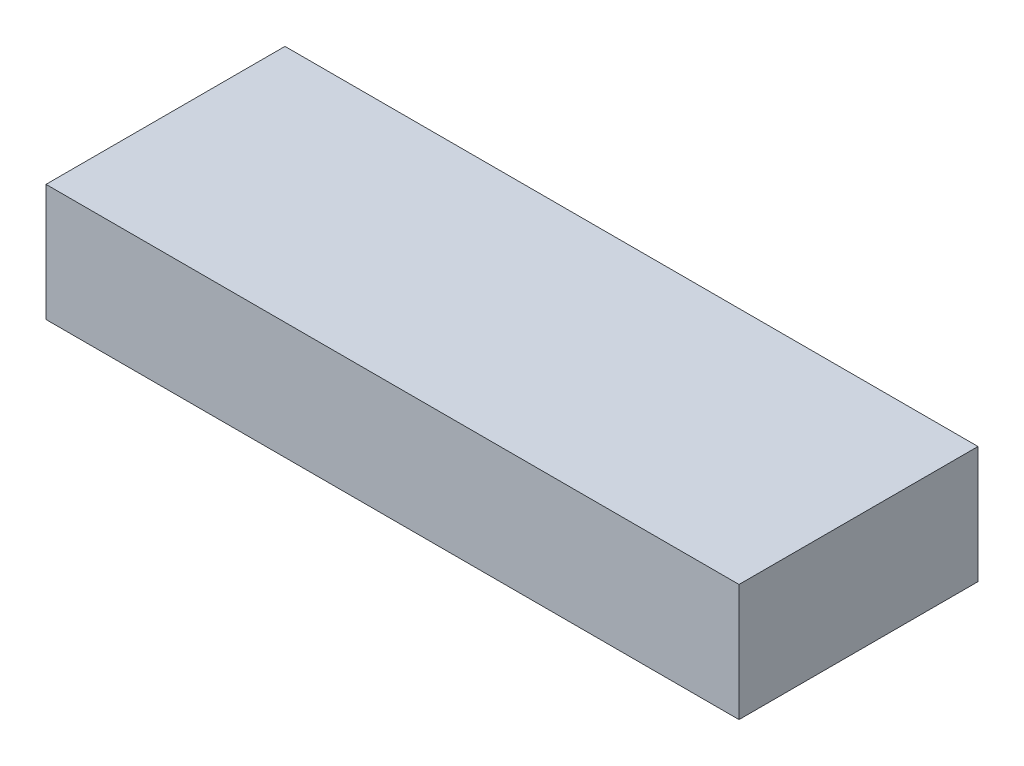
ISO-10303-21;
HEADER;
FILE_DESCRIPTION(('STEP AP214'),'2;1');
FILE_NAME('part.step','',(''),(''),'','','');
FILE_SCHEMA(('AUTOMOTIVE_DESIGN { 1 0 10303 214 1 1 1 1 }'));
ENDSEC;
DATA;
#1=APPLICATION_CONTEXT('core data for automotive mechanical design processes');
#2=APPLICATION_PROTOCOL_DEFINITION('international standard','automotive_design',2000,#1);
#3=PRODUCT_CONTEXT('',#1,'mechanical');
#4=PRODUCT('Part','Part','',(#3));
#5=PRODUCT_RELATED_PRODUCT_CATEGORY('part','',(#4));
#6=PRODUCT_DEFINITION_FORMATION('','',#4);
#7=PRODUCT_DEFINITION_CONTEXT('part definition',#1,'design');
#8=PRODUCT_DEFINITION('design','',#6,#7);
#9=PRODUCT_DEFINITION_SHAPE('','',#8);
#10=(LENGTH_UNIT() NAMED_UNIT(*) SI_UNIT(.MILLI.,.METRE.));
#11=(NAMED_UNIT(*) PLANE_ANGLE_UNIT() SI_UNIT($,.RADIAN.));
#12=(NAMED_UNIT(*) SI_UNIT($,.STERADIAN.) SOLID_ANGLE_UNIT());
#13=UNCERTAINTY_MEASURE_WITH_UNIT(LENGTH_MEASURE(1.E-05),#10,'distance_accuracy_value','');
#14=(GEOMETRIC_REPRESENTATION_CONTEXT(3) GLOBAL_UNCERTAINTY_ASSIGNED_CONTEXT((#13)) GLOBAL_UNIT_ASSIGNED_CONTEXT((#10,
#11,#12)) REPRESENTATION_CONTEXT('',''));
#15=CARTESIAN_POINT('',(0.,0.,0.));
#16=DIRECTION('',(0.,0.,1.));
#17=DIRECTION('',(1.,0.,0.));
#18=AXIS2_PLACEMENT_3D('',#15,#16,#17);
#19=CARTESIAN_POINT('',(10.14949202,-1.71448984,0.));
#20=DIRECTION('',(0.,-1.,0.));
#21=DIRECTION('',(0.,0.,-1.));
#22=AXIS2_PLACEMENT_3D('',#19,#20,#21);
#23=PLANE('',#22);
#24=DIRECTION('',(0.,0.,1.));
#25=VECTOR('',#24,1.);
#26=CARTESIAN_POINT('',(-10.14949202,-1.71448984,0.));
#27=LINE('',#26,#25);
#28=CARTESIAN_POINT('',(-10.14949202,-1.71448984,0.));
#29=VERTEX_POINT('',#28);
#30=CARTESIAN_POINT('',(-10.14949202,-1.71448984,7.00000124));
#31=VERTEX_POINT('',#30);
#32=EDGE_CURVE('E20',#29,#31,#27,.T.);
#33=ORIENTED_EDGE('',*,*,#32,.F.);
#34=DIRECTION('',(1.,0.,0.));
#35=VECTOR('',#34,1.);
#36=CARTESIAN_POINT('',(-10.14949202,-1.71448984,0.));
#37=LINE('',#36,#35);
#38=CARTESIAN_POINT('',(10.14949202,-1.71448984,0.));
#39=VERTEX_POINT('',#38);
#40=EDGE_CURVE('E79',#29,#39,#37,.T.);
#41=ORIENTED_EDGE('',*,*,#40,.T.);
#42=DIRECTION('',(0.,0.,-1.));
#43=VECTOR('',#42,1.);
#44=CARTESIAN_POINT('',(10.14949202,-1.71448984,0.));
#45=LINE('',#44,#43);
#46=CARTESIAN_POINT('',(10.14949202,-1.71448984,7.00000124));
#47=VERTEX_POINT('',#46);
#48=EDGE_CURVE('E61',#47,#39,#45,.T.);
#49=ORIENTED_EDGE('',*,*,#48,.F.);
#50=DIRECTION('',(1.,0.,0.));
#51=VECTOR('',#50,1.);
#52=CARTESIAN_POINT('',(-10.14949202,-1.71448984,7.00000124));
#53=LINE('',#52,#51);
#54=EDGE_CURVE('E56',#31,#47,#53,.T.);
#55=ORIENTED_EDGE('',*,*,#54,.F.);
#56=EDGE_LOOP('',(#33,#41,#49,#55));
#57=FACE_BOUND('',#56,.T.);
#58=ADVANCED_FACE('F17',(#57),#23,.T.);
#59=CARTESIAN_POINT('',(-10.14949202,-1.71448984,0.));
#60=DIRECTION('',(-1.,0.,0.));
#61=DIRECTION('',(0.,0.,1.));
#62=AXIS2_PLACEMENT_3D('',#59,#60,#61);
#63=PLANE('',#62);
#64=DIRECTION('',(0.,0.,1.));
#65=VECTOR('',#64,1.);
#66=CARTESIAN_POINT('',(-10.14949202,1.71449238,0.));
#67=LINE('',#66,#65);
#68=CARTESIAN_POINT('',(-10.14949202,1.71449238,0.));
#69=VERTEX_POINT('',#68);
#70=CARTESIAN_POINT('',(-10.14949202,1.71449238,7.00000124));
#71=VERTEX_POINT('',#70);
#72=EDGE_CURVE('E83',#69,#71,#67,.T.);
#73=ORIENTED_EDGE('',*,*,#72,.F.);
#74=DIRECTION('',(0.,1.,0.));
#75=VECTOR('',#74,1.);
#76=CARTESIAN_POINT('',(-10.14949202,-1.71448984,0.));
#77=LINE('',#76,#75);
#78=EDGE_CURVE('E68',#69,#29,#77,.F.);
#79=ORIENTED_EDGE('',*,*,#78,.T.);
#80=ORIENTED_EDGE('',*,*,#32,.T.);
#81=DIRECTION('',(0.,1.,0.));
#82=VECTOR('',#81,1.);
#83=CARTESIAN_POINT('',(-10.14949202,-1.71448984,7.00000124));
#84=LINE('',#83,#82);
#85=EDGE_CURVE('E63',#71,#31,#84,.F.);
#86=ORIENTED_EDGE('',*,*,#85,.F.);
#87=EDGE_LOOP('',(#73,#79,#80,#86));
#88=FACE_BOUND('',#87,.T.);
#89=ADVANCED_FACE('F65',(#88),#63,.T.);
#90=CARTESIAN_POINT('',(-10.14949202,-1.71448984,7.00000124));
#91=DIRECTION('',(0.,0.,1.));
#92=DIRECTION('',(1.,0.,0.));
#93=AXIS2_PLACEMENT_3D('',#90,#91,#92);
#94=PLANE('',#93);
#95=DIRECTION('',(1.,0.,0.));
#96=VECTOR('',#95,1.);
#97=CARTESIAN_POINT('',(-10.14949202,1.71449238,7.00000124));
#98=LINE('',#97,#96);
#99=CARTESIAN_POINT('',(10.14949202,1.71449238,7.00000124));
#100=VERTEX_POINT('',#99);
#101=EDGE_CURVE('E72',#71,#100,#98,.T.);
#102=ORIENTED_EDGE('',*,*,#101,.F.);
#103=ORIENTED_EDGE('',*,*,#85,.T.);
#104=ORIENTED_EDGE('',*,*,#54,.T.);
#105=DIRECTION('',(0.,1.,0.));
#106=VECTOR('',#105,1.);
#107=CARTESIAN_POINT('',(10.14949202,1.71449238,7.00000124));
#108=LINE('',#107,#106);
#109=EDGE_CURVE('E74',#100,#47,#108,.F.);
#110=ORIENTED_EDGE('',*,*,#109,.F.);
#111=EDGE_LOOP('',(#102,#103,#104,#110));
#112=FACE_BOUND('',#111,.T.);
#113=ADVANCED_FACE('F70',(#112),#94,.T.);
#114=CARTESIAN_POINT('',(10.14949202,1.71449238,0.));
#115=DIRECTION('',(1.,0.,0.));
#116=DIRECTION('',(0.,0.,-1.));
#117=AXIS2_PLACEMENT_3D('',#114,#115,#116);
#118=PLANE('',#117);
#119=ORIENTED_EDGE('',*,*,#48,.T.);
#120=DIRECTION('',(0.,1.,0.));
#121=VECTOR('',#120,1.);
#122=CARTESIAN_POINT('',(10.14949202,-1.71448984,0.));
#123=LINE('',#122,#121);
#124=CARTESIAN_POINT('',(10.14949202,1.71449238,0.));
#125=VERTEX_POINT('',#124);
#126=EDGE_CURVE('E35',#39,#125,#123,.T.);
#127=ORIENTED_EDGE('',*,*,#126,.T.);
#128=DIRECTION('',(0.,0.,1.));
#129=VECTOR('',#128,1.);
#130=CARTESIAN_POINT('',(10.14949202,1.71449238,0.));
#131=LINE('',#130,#129);
#132=EDGE_CURVE('E26',#100,#125,#131,.F.);
#133=ORIENTED_EDGE('',*,*,#132,.F.);
#134=ORIENTED_EDGE('',*,*,#109,.T.);
#135=EDGE_LOOP('',(#119,#127,#133,#134));
#136=FACE_BOUND('',#135,.T.);
#137=ADVANCED_FACE('F89',(#136),#118,.T.);
#138=CARTESIAN_POINT('',(-10.14949202,-1.71448984,0.));
#139=DIRECTION('',(0.,0.,1.));
#140=DIRECTION('',(1.,0.,0.));
#141=AXIS2_PLACEMENT_3D('',#138,#139,#140);
#142=PLANE('',#141);
#143=DIRECTION('',(1.,0.,0.));
#144=VECTOR('',#143,1.);
#145=CARTESIAN_POINT('',(-10.14949202,1.71449238,0.));
#146=LINE('',#145,#144);
#147=EDGE_CURVE('E11',#125,#69,#146,.F.);
#148=ORIENTED_EDGE('',*,*,#147,.F.);
#149=ORIENTED_EDGE('',*,*,#126,.F.);
#150=ORIENTED_EDGE('',*,*,#40,.F.);
#151=ORIENTED_EDGE('',*,*,#78,.F.);
#152=EDGE_LOOP('',(#148,#149,#150,#151));
#153=FACE_BOUND('',#152,.T.);
#154=ADVANCED_FACE('F91',(#153),#142,.F.);
#155=CARTESIAN_POINT('',(-10.14949202,1.71449238,0.));
#156=DIRECTION('',(0.,1.,0.));
#157=DIRECTION('',(0.,0.,1.));
#158=AXIS2_PLACEMENT_3D('',#155,#156,#157);
#159=PLANE('',#158);
#160=ORIENTED_EDGE('',*,*,#132,.T.);
#161=ORIENTED_EDGE('',*,*,#147,.T.);
#162=ORIENTED_EDGE('',*,*,#72,.T.);
#163=ORIENTED_EDGE('',*,*,#101,.T.);
#164=EDGE_LOOP('',(#160,#161,#162,#163));
#165=FACE_BOUND('',#164,.T.);
#166=ADVANCED_FACE('F88',(#165),#159,.T.);
#167=CLOSED_SHELL('',(#58,#89,#113,#137,#154,#166));
#168=MANIFOLD_SOLID_BREP('B1',#167);
#169=ADVANCED_BREP_SHAPE_REPRESENTATION('',(#18,#168),#14);
#170=SHAPE_DEFINITION_REPRESENTATION(#9,#169);
ENDSEC;
END-ISO-10303-21;
